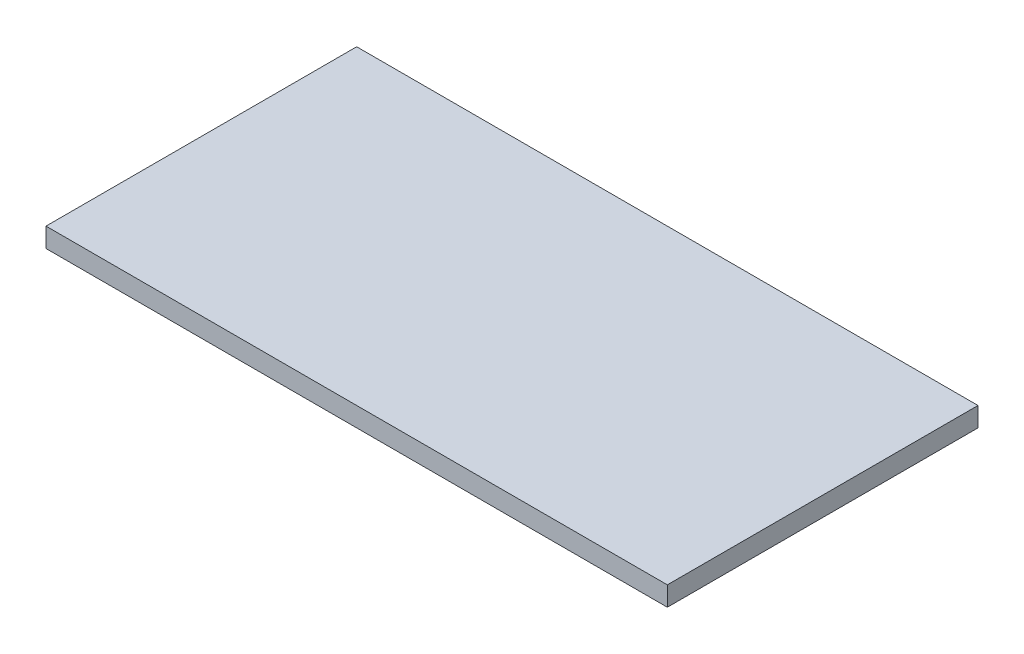
ISO-10303-21;
HEADER;
FILE_DESCRIPTION(('STEP AP214'),'2;1');
FILE_NAME('part.step','',(''),(''),'','','');
FILE_SCHEMA(('AUTOMOTIVE_DESIGN { 1 0 10303 214 1 1 1 1 }'));
ENDSEC;
DATA;
#1=APPLICATION_CONTEXT('core data for automotive mechanical design processes');
#2=APPLICATION_PROTOCOL_DEFINITION('international standard','automotive_design',2000,#1);
#3=PRODUCT_CONTEXT('',#1,'mechanical');
#4=PRODUCT('Part','Part','',(#3));
#5=PRODUCT_RELATED_PRODUCT_CATEGORY('part','',(#4));
#6=PRODUCT_DEFINITION_FORMATION('','',#4);
#7=PRODUCT_DEFINITION_CONTEXT('part definition',#1,'design');
#8=PRODUCT_DEFINITION('design','',#6,#7);
#9=PRODUCT_DEFINITION_SHAPE('','',#8);
#10=(LENGTH_UNIT() NAMED_UNIT(*) SI_UNIT(.MILLI.,.METRE.));
#11=(NAMED_UNIT(*) PLANE_ANGLE_UNIT() SI_UNIT($,.RADIAN.));
#12=(NAMED_UNIT(*) SI_UNIT($,.STERADIAN.) SOLID_ANGLE_UNIT());
#13=UNCERTAINTY_MEASURE_WITH_UNIT(LENGTH_MEASURE(1.E-05),#10,'distance_accuracy_value','');
#14=(GEOMETRIC_REPRESENTATION_CONTEXT(3) GLOBAL_UNCERTAINTY_ASSIGNED_CONTEXT((#13)) GLOBAL_UNIT_ASSIGNED_CONTEXT((#10,
#11,#12)) REPRESENTATION_CONTEXT('',''));
#15=CARTESIAN_POINT('',(0.,0.,0.));
#16=DIRECTION('',(0.,0.,1.));
#17=DIRECTION('',(1.,0.,0.));
#18=AXIS2_PLACEMENT_3D('',#15,#16,#17);
#19=CARTESIAN_POINT('',(50.8,3.175,-25.4));
#20=DIRECTION('',(-1.,0.,0.));
#21=DIRECTION('',(0.,0.,1.));
#22=AXIS2_PLACEMENT_3D('',#19,#20,#21);
#23=PLANE('',#22);
#24=DIRECTION('',(0.,0.,-1.));
#25=VECTOR('',#24,1.);
#26=CARTESIAN_POINT('',(50.8,0.,-25.4));
#27=LINE('',#26,#25);
#28=CARTESIAN_POINT('',(50.8,0.,25.4));
#29=VERTEX_POINT('',#28);
#30=CARTESIAN_POINT('',(50.8,0.,-25.4));
#31=VERTEX_POINT('',#30);
#32=EDGE_CURVE('E111',#29,#31,#27,.T.);
#33=ORIENTED_EDGE('',*,*,#32,.T.);
#34=DIRECTION('',(0.,-1.,0.));
#35=VECTOR('',#34,1.);
#36=CARTESIAN_POINT('',(50.8,3.175,-25.4));
#37=LINE('',#36,#35);
#38=CARTESIAN_POINT('',(50.8,3.175,-25.4));
#39=VERTEX_POINT('',#38);
#40=EDGE_CURVE('E11',#39,#31,#37,.T.);
#41=ORIENTED_EDGE('',*,*,#40,.F.);
#42=DIRECTION('',(0.,0.,-1.));
#43=VECTOR('',#42,1.);
#44=CARTESIAN_POINT('',(50.8,3.175,-25.4));
#45=LINE('',#44,#43);
#46=CARTESIAN_POINT('',(50.8,3.175,25.4));
#47=VERTEX_POINT('',#46);
#48=EDGE_CURVE('E95',#47,#39,#45,.T.);
#49=ORIENTED_EDGE('',*,*,#48,.F.);
#50=DIRECTION('',(0.,-1.,0.));
#51=VECTOR('',#50,1.);
#52=CARTESIAN_POINT('',(50.8,3.175,25.4));
#53=LINE('',#52,#51);
#54=EDGE_CURVE('E107',#47,#29,#53,.T.);
#55=ORIENTED_EDGE('',*,*,#54,.T.);
#56=EDGE_LOOP('',(#33,#41,#49,#55));
#57=FACE_BOUND('',#56,.T.);
#58=ADVANCED_FACE('F43',(#57),#23,.F.);
#59=CARTESIAN_POINT('',(-50.8,3.175,-25.4));
#60=DIRECTION('',(0.,0.,1.));
#61=DIRECTION('',(1.,0.,0.));
#62=AXIS2_PLACEMENT_3D('',#59,#60,#61);
#63=PLANE('',#62);
#64=DIRECTION('',(-1.,0.,0.));
#65=VECTOR('',#64,1.);
#66=CARTESIAN_POINT('',(-50.8,0.,-25.4));
#67=LINE('',#66,#65);
#68=CARTESIAN_POINT('',(-50.8,0.,-25.4));
#69=VERTEX_POINT('',#68);
#70=EDGE_CURVE('E100',#31,#69,#67,.T.);
#71=ORIENTED_EDGE('',*,*,#70,.T.);
#72=DIRECTION('',(0.,-1.,0.));
#73=VECTOR('',#72,1.);
#74=CARTESIAN_POINT('',(-50.8,3.175,-25.4));
#75=LINE('',#74,#73);
#76=CARTESIAN_POINT('',(-50.8,3.175,-25.4));
#77=VERTEX_POINT('',#76);
#78=EDGE_CURVE('E52',#77,#69,#75,.T.);
#79=ORIENTED_EDGE('',*,*,#78,.F.);
#80=DIRECTION('',(-1.,0.,0.));
#81=VECTOR('',#80,1.);
#82=CARTESIAN_POINT('',(-50.8,3.175,-25.4));
#83=LINE('',#82,#81);
#84=EDGE_CURVE('E90',#39,#77,#83,.T.);
#85=ORIENTED_EDGE('',*,*,#84,.F.);
#86=ORIENTED_EDGE('',*,*,#40,.T.);
#87=EDGE_LOOP('',(#71,#79,#85,#86));
#88=FACE_BOUND('',#87,.T.);
#89=ADVANCED_FACE('F99',(#88),#63,.F.);
#90=CARTESIAN_POINT('',(-50.8,3.175,-25.4));
#91=DIRECTION('',(1.,0.,0.));
#92=DIRECTION('',(0.,0.,-1.));
#93=AXIS2_PLACEMENT_3D('',#90,#91,#92);
#94=PLANE('',#93);
#95=DIRECTION('',(0.,0.,1.));
#96=VECTOR('',#95,1.);
#97=CARTESIAN_POINT('',(-50.8,0.,-25.4));
#98=LINE('',#97,#96);
#99=CARTESIAN_POINT('',(-50.8,0.,25.4));
#100=VERTEX_POINT('',#99);
#101=EDGE_CURVE('E77',#69,#100,#98,.T.);
#102=ORIENTED_EDGE('',*,*,#101,.T.);
#103=DIRECTION('',(0.,-1.,0.));
#104=VECTOR('',#103,1.);
#105=CARTESIAN_POINT('',(-50.8,3.175,25.4));
#106=LINE('',#105,#104);
#107=CARTESIAN_POINT('',(-50.8,3.175,25.4));
#108=VERTEX_POINT('',#107);
#109=EDGE_CURVE('E102',#108,#100,#106,.T.);
#110=ORIENTED_EDGE('',*,*,#109,.F.);
#111=DIRECTION('',(0.,0.,1.));
#112=VECTOR('',#111,1.);
#113=CARTESIAN_POINT('',(-50.8,3.175,-25.4));
#114=LINE('',#113,#112);
#115=EDGE_CURVE('E93',#77,#108,#114,.T.);
#116=ORIENTED_EDGE('',*,*,#115,.F.);
#117=ORIENTED_EDGE('',*,*,#78,.T.);
#118=EDGE_LOOP('',(#102,#110,#116,#117));
#119=FACE_BOUND('',#118,.T.);
#120=ADVANCED_FACE('F103',(#119),#94,.F.);
#121=CARTESIAN_POINT('',(-50.8,3.175,25.4));
#122=DIRECTION('',(0.,0.,-1.));
#123=DIRECTION('',(-1.,0.,0.));
#124=AXIS2_PLACEMENT_3D('',#121,#122,#123);
#125=PLANE('',#124);
#126=DIRECTION('',(1.,0.,0.));
#127=VECTOR('',#126,1.);
#128=CARTESIAN_POINT('',(-50.8,0.,25.4));
#129=LINE('',#128,#127);
#130=EDGE_CURVE('E83',#100,#29,#129,.T.);
#131=ORIENTED_EDGE('',*,*,#130,.T.);
#132=ORIENTED_EDGE('',*,*,#54,.F.);
#133=DIRECTION('',(1.,0.,0.));
#134=VECTOR('',#133,1.);
#135=CARTESIAN_POINT('',(-50.8,3.175,25.4));
#136=LINE('',#135,#134);
#137=EDGE_CURVE('E60',#108,#47,#136,.T.);
#138=ORIENTED_EDGE('',*,*,#137,.F.);
#139=ORIENTED_EDGE('',*,*,#109,.T.);
#140=EDGE_LOOP('',(#131,#132,#138,#139));
#141=FACE_BOUND('',#140,.T.);
#142=ADVANCED_FACE('F124',(#141),#125,.F.);
#143=CARTESIAN_POINT('',(0.,3.175,0.));
#144=DIRECTION('',(0.,1.,0.));
#145=DIRECTION('',(0.,0.,1.));
#146=AXIS2_PLACEMENT_3D('',#143,#144,#145);
#147=PLANE('',#146);
#148=ORIENTED_EDGE('',*,*,#48,.T.);
#149=ORIENTED_EDGE('',*,*,#84,.T.);
#150=ORIENTED_EDGE('',*,*,#115,.T.);
#151=ORIENTED_EDGE('',*,*,#137,.T.);
#152=EDGE_LOOP('',(#148,#149,#150,#151));
#153=FACE_BOUND('',#152,.T.);
#154=ADVANCED_FACE('F91',(#153),#147,.T.);
#155=CARTESIAN_POINT('',(0.,0.,0.));
#156=DIRECTION('',(0.,1.,0.));
#157=DIRECTION('',(0.,0.,1.));
#158=AXIS2_PLACEMENT_3D('',#155,#156,#157);
#159=PLANE('',#158);
#160=ORIENTED_EDGE('',*,*,#32,.F.);
#161=ORIENTED_EDGE('',*,*,#130,.F.);
#162=ORIENTED_EDGE('',*,*,#101,.F.);
#163=ORIENTED_EDGE('',*,*,#70,.F.);
#164=EDGE_LOOP('',(#160,#161,#162,#163));
#165=FACE_BOUND('',#164,.T.);
#166=ADVANCED_FACE('F127',(#165),#159,.F.);
#167=CLOSED_SHELL('',(#58,#89,#120,#142,#154,#166));
#168=MANIFOLD_SOLID_BREP('B2',#167);
#169=ADVANCED_BREP_SHAPE_REPRESENTATION('',(#18,#168),#14);
#170=SHAPE_DEFINITION_REPRESENTATION(#9,#169);
ENDSEC;
END-ISO-10303-21;
